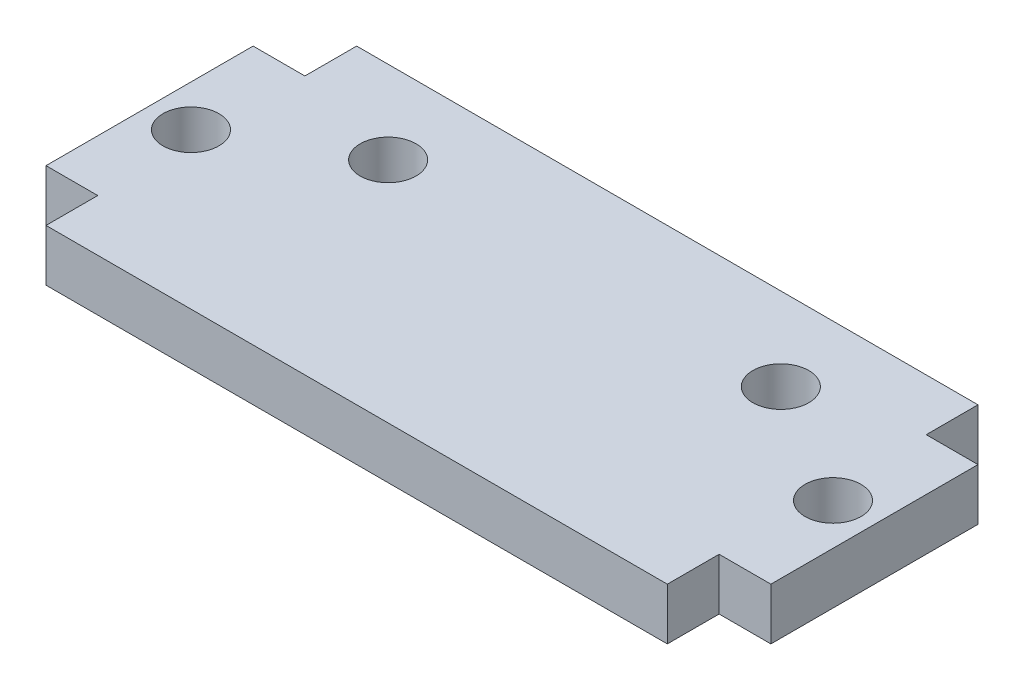
ISO-10303-21;
HEADER;
FILE_DESCRIPTION(('STEP AP214'),'2;1');
FILE_NAME('part.step','',(''),(''),'','','');
FILE_SCHEMA(('AUTOMOTIVE_DESIGN { 1 0 10303 214 1 1 1 1 }'));
ENDSEC;
DATA;
#1=APPLICATION_CONTEXT('core data for automotive mechanical design processes');
#2=APPLICATION_PROTOCOL_DEFINITION('international standard','automotive_design',2000,#1);
#3=PRODUCT_CONTEXT('',#1,'mechanical');
#4=PRODUCT('Part','Part','',(#3));
#5=PRODUCT_RELATED_PRODUCT_CATEGORY('part','',(#4));
#6=PRODUCT_DEFINITION_FORMATION('','',#4);
#7=PRODUCT_DEFINITION_CONTEXT('part definition',#1,'design');
#8=PRODUCT_DEFINITION('design','',#6,#7);
#9=PRODUCT_DEFINITION_SHAPE('','',#8);
#10=(LENGTH_UNIT() NAMED_UNIT(*) SI_UNIT(.MILLI.,.METRE.));
#11=(NAMED_UNIT(*) PLANE_ANGLE_UNIT() SI_UNIT($,.RADIAN.));
#12=(NAMED_UNIT(*) SI_UNIT($,.STERADIAN.) SOLID_ANGLE_UNIT());
#13=UNCERTAINTY_MEASURE_WITH_UNIT(LENGTH_MEASURE(1.E-05),#10,'distance_accuracy_value','');
#14=(GEOMETRIC_REPRESENTATION_CONTEXT(3) GLOBAL_UNCERTAINTY_ASSIGNED_CONTEXT((#13)) GLOBAL_UNIT_ASSIGNED_CONTEXT((#10,
#11,#12)) REPRESENTATION_CONTEXT('',''));
#15=CARTESIAN_POINT('',(0.,0.,0.));
#16=DIRECTION('',(0.,0.,1.));
#17=DIRECTION('',(1.,0.,0.));
#18=AXIS2_PLACEMENT_3D('',#15,#16,#17);
#19=CARTESIAN_POINT('',(0.,3.175,0.));
#20=DIRECTION('',(0.,1.,0.));
#21=DIRECTION('',(0.,0.,1.));
#22=AXIS2_PLACEMENT_3D('',#19,#20,#21);
#23=PLANE('',#22);
#24=CARTESIAN_POINT('',(-12.0396,3.175,-13.97));
#25=DIRECTION('',(0.,1.,0.));
#26=DIRECTION('',(0.,0.,1.));
#27=AXIS2_PLACEMENT_3D('',#24,#25,#26);
#28=CIRCLE('',#27,1.7145);
#29=CARTESIAN_POINT('',(-12.0396,3.175,-12.2555));
#30=VERTEX_POINT('',#29);
#31=EDGE_CURVE('E291',#30,#30,#28,.T.);
#32=ORIENTED_EDGE('',*,*,#31,.F.);
#33=EDGE_LOOP('',(#32));
#34=FACE_BOUND('',#33,.T.);
#35=CARTESIAN_POINT('',(-19.685,3.175,-9.52499999999999));
#36=DIRECTION('',(0.,1.,0.));
#37=DIRECTION('',(0.,0.,1.));
#38=AXIS2_PLACEMENT_3D('',#35,#36,#37);
#39=CIRCLE('',#38,1.7145);
#40=CARTESIAN_POINT('',(-19.685,3.175,-7.81049999999999));
#41=VERTEX_POINT('',#40);
#42=EDGE_CURVE('E158',#41,#41,#39,.T.);
#43=ORIENTED_EDGE('',*,*,#42,.F.);
#44=EDGE_LOOP('',(#43));
#45=FACE_BOUND('',#44,.T.);
#46=DIRECTION('',(0.,0.,1.));
#47=VECTOR('',#46,1.);
#48=CARTESIAN_POINT('',(-19.05,3.175,0.));
#49=LINE('',#48,#47);
#50=CARTESIAN_POINT('',(-19.05,3.175,-3.175));
#51=VERTEX_POINT('',#50);
#52=CARTESIAN_POINT('',(-19.05,3.175,0.));
#53=VERTEX_POINT('',#52);
#54=EDGE_CURVE('E177',#51,#53,#49,.T.);
#55=ORIENTED_EDGE('',*,*,#54,.T.);
#56=DIRECTION('',(1.,0.,0.));
#57=VECTOR('',#56,1.);
#58=CARTESIAN_POINT('',(19.05,3.175,0.));
#59=LINE('',#58,#57);
#60=CARTESIAN_POINT('',(19.05,3.175,0.));
#61=VERTEX_POINT('',#60);
#62=EDGE_CURVE('E105',#53,#61,#59,.T.);
#63=ORIENTED_EDGE('',*,*,#62,.T.);
#64=DIRECTION('',(0.,0.,-1.));
#65=VECTOR('',#64,1.);
#66=CARTESIAN_POINT('',(19.05,3.175,0.));
#67=LINE('',#66,#65);
#68=CARTESIAN_POINT('',(19.05,3.175,-3.175));
#69=VERTEX_POINT('',#68);
#70=EDGE_CURVE('E204',#61,#69,#67,.T.);
#71=ORIENTED_EDGE('',*,*,#70,.T.);
#72=DIRECTION('',(1.,0.,0.));
#73=VECTOR('',#72,1.);
#74=CARTESIAN_POINT('',(19.05,3.175,-3.175));
#75=LINE('',#74,#73);
#76=CARTESIAN_POINT('',(22.225,3.175,-3.175));
#77=VERTEX_POINT('',#76);
#78=EDGE_CURVE('E223',#69,#77,#75,.T.);
#79=ORIENTED_EDGE('',*,*,#78,.T.);
#80=DIRECTION('',(0.,0.,-1.));
#81=VECTOR('',#80,1.);
#82=CARTESIAN_POINT('',(22.225,3.175,-3.175));
#83=LINE('',#82,#81);
#84=CARTESIAN_POINT('',(22.225,3.175,-15.875));
#85=VERTEX_POINT('',#84);
#86=EDGE_CURVE('E220',#77,#85,#83,.T.);
#87=ORIENTED_EDGE('',*,*,#86,.T.);
#88=DIRECTION('',(-1.,0.,0.));
#89=VECTOR('',#88,1.);
#90=CARTESIAN_POINT('',(22.225,3.175,-15.875));
#91=LINE('',#90,#89);
#92=CARTESIAN_POINT('',(19.05,3.175,-15.875));
#93=VERTEX_POINT('',#92);
#94=EDGE_CURVE('E222',#85,#93,#91,.T.);
#95=ORIENTED_EDGE('',*,*,#94,.T.);
#96=DIRECTION('',(0.,0.,-1.));
#97=VECTOR('',#96,1.);
#98=CARTESIAN_POINT('',(19.05,3.175,-15.875));
#99=LINE('',#98,#97);
#100=CARTESIAN_POINT('',(19.05,3.175,-19.05));
#101=VERTEX_POINT('',#100);
#102=EDGE_CURVE('E225',#93,#101,#99,.T.);
#103=ORIENTED_EDGE('',*,*,#102,.T.);
#104=DIRECTION('',(-1.,0.,0.));
#105=VECTOR('',#104,1.);
#106=CARTESIAN_POINT('',(-19.05,3.175,-19.05));
#107=LINE('',#106,#105);
#108=CARTESIAN_POINT('',(-19.05,3.175,-19.05));
#109=VERTEX_POINT('',#108);
#110=EDGE_CURVE('E231',#101,#109,#107,.T.);
#111=ORIENTED_EDGE('',*,*,#110,.T.);
#112=DIRECTION('',(0.,0.,1.));
#113=VECTOR('',#112,1.);
#114=CARTESIAN_POINT('',(-19.05,3.175,-15.875));
#115=LINE('',#114,#113);
#116=CARTESIAN_POINT('',(-19.05,3.175,-15.875));
#117=VERTEX_POINT('',#116);
#118=EDGE_CURVE('E136',#109,#117,#115,.T.);
#119=ORIENTED_EDGE('',*,*,#118,.T.);
#120=DIRECTION('',(-1.,0.,0.));
#121=VECTOR('',#120,1.);
#122=CARTESIAN_POINT('',(-22.225,3.175,-15.875));
#123=LINE('',#122,#121);
#124=CARTESIAN_POINT('',(-22.225,3.175,-15.875));
#125=VERTEX_POINT('',#124);
#126=EDGE_CURVE('E130',#117,#125,#123,.T.);
#127=ORIENTED_EDGE('',*,*,#126,.T.);
#128=DIRECTION('',(0.,0.,1.));
#129=VECTOR('',#128,1.);
#130=CARTESIAN_POINT('',(-22.225,3.175,-3.175));
#131=LINE('',#130,#129);
#132=CARTESIAN_POINT('',(-22.225,3.175,-3.175));
#133=VERTEX_POINT('',#132);
#134=EDGE_CURVE('E134',#125,#133,#131,.T.);
#135=ORIENTED_EDGE('',*,*,#134,.T.);
#136=DIRECTION('',(1.,0.,0.));
#137=VECTOR('',#136,1.);
#138=CARTESIAN_POINT('',(-19.05,3.175,-3.175));
#139=LINE('',#138,#137);
#140=EDGE_CURVE('E50',#133,#51,#139,.T.);
#141=ORIENTED_EDGE('',*,*,#140,.T.);
#142=EDGE_LOOP('',(#55,#63,#71,#79,#87,#95,#103,#111,#119,#127,#135,#141));
#143=FACE_BOUND('',#142,.T.);
#144=CARTESIAN_POINT('',(19.685,3.175,-9.525));
#145=DIRECTION('',(0.,1.,0.));
#146=DIRECTION('',(0.,0.,-1.));
#147=AXIS2_PLACEMENT_3D('',#144,#145,#146);
#148=CIRCLE('',#147,1.7145);
#149=CARTESIAN_POINT('',(19.685,3.175,-11.2395));
#150=VERTEX_POINT('',#149);
#151=EDGE_CURVE('E297',#150,#150,#148,.T.);
#152=ORIENTED_EDGE('',*,*,#151,.F.);
#153=EDGE_LOOP('',(#152));
#154=FACE_BOUND('',#153,.T.);
#155=CARTESIAN_POINT('',(12.0396,3.175,-13.97));
#156=DIRECTION('',(0.,1.,0.));
#157=DIRECTION('',(0.,0.,-1.));
#158=AXIS2_PLACEMENT_3D('',#155,#156,#157);
#159=CIRCLE('',#158,1.7145);
#160=CARTESIAN_POINT('',(12.0396,3.175,-15.6845));
#161=VERTEX_POINT('',#160);
#162=EDGE_CURVE('E282',#161,#161,#159,.T.);
#163=ORIENTED_EDGE('',*,*,#162,.F.);
#164=EDGE_LOOP('',(#163));
#165=FACE_BOUND('',#164,.T.);
#166=ADVANCED_FACE('F33',(#34,#45,#143,#154,#165),#23,.T.);
#167=CARTESIAN_POINT('',(0.,0.,0.));
#168=DIRECTION('',(0.,1.,0.));
#169=DIRECTION('',(0.,0.,1.));
#170=AXIS2_PLACEMENT_3D('',#167,#168,#169);
#171=PLANE('',#170);
#172=DIRECTION('',(0.,0.,1.));
#173=VECTOR('',#172,1.);
#174=CARTESIAN_POINT('',(-19.05,0.,0.));
#175=LINE('',#174,#173);
#176=CARTESIAN_POINT('',(-19.05,0.,-3.175));
#177=VERTEX_POINT('',#176);
#178=CARTESIAN_POINT('',(-19.05,0.,0.));
#179=VERTEX_POINT('',#178);
#180=EDGE_CURVE('E154',#177,#179,#175,.T.);
#181=ORIENTED_EDGE('',*,*,#180,.F.);
#182=DIRECTION('',(1.,0.,0.));
#183=VECTOR('',#182,1.);
#184=CARTESIAN_POINT('',(-19.05,0.,-3.175));
#185=LINE('',#184,#183);
#186=CARTESIAN_POINT('',(-22.225,0.,-3.175));
#187=VERTEX_POINT('',#186);
#188=EDGE_CURVE('E97',#187,#177,#185,.T.);
#189=ORIENTED_EDGE('',*,*,#188,.F.);
#190=DIRECTION('',(0.,0.,1.));
#191=VECTOR('',#190,1.);
#192=CARTESIAN_POINT('',(-22.225,0.,-3.175));
#193=LINE('',#192,#191);
#194=CARTESIAN_POINT('',(-22.225,0.,-15.875));
#195=VERTEX_POINT('',#194);
#196=EDGE_CURVE('E91',#195,#187,#193,.T.);
#197=ORIENTED_EDGE('',*,*,#196,.F.);
#198=DIRECTION('',(-1.,0.,0.));
#199=VECTOR('',#198,1.);
#200=CARTESIAN_POINT('',(-22.225,0.,-15.875));
#201=LINE('',#200,#199);
#202=CARTESIAN_POINT('',(-19.05,0.,-15.875));
#203=VERTEX_POINT('',#202);
#204=EDGE_CURVE('E144',#203,#195,#201,.T.);
#205=ORIENTED_EDGE('',*,*,#204,.F.);
#206=DIRECTION('',(0.,0.,1.));
#207=VECTOR('',#206,1.);
#208=CARTESIAN_POINT('',(-19.05,0.,-15.875));
#209=LINE('',#208,#207);
#210=CARTESIAN_POINT('',(-19.05,0.,-19.05));
#211=VERTEX_POINT('',#210);
#212=EDGE_CURVE('E172',#211,#203,#209,.T.);
#213=ORIENTED_EDGE('',*,*,#212,.F.);
#214=DIRECTION('',(-1.,0.,0.));
#215=VECTOR('',#214,1.);
#216=CARTESIAN_POINT('',(-19.05,0.,-19.05));
#217=LINE('',#216,#215);
#218=CARTESIAN_POINT('',(19.05,0.,-19.05));
#219=VERTEX_POINT('',#218);
#220=EDGE_CURVE('E170',#219,#211,#217,.T.);
#221=ORIENTED_EDGE('',*,*,#220,.F.);
#222=DIRECTION('',(0.,0.,-1.));
#223=VECTOR('',#222,1.);
#224=CARTESIAN_POINT('',(19.05,0.,-15.875));
#225=LINE('',#224,#223);
#226=CARTESIAN_POINT('',(19.05,0.,-15.875));
#227=VERTEX_POINT('',#226);
#228=EDGE_CURVE('E168',#227,#219,#225,.T.);
#229=ORIENTED_EDGE('',*,*,#228,.F.);
#230=DIRECTION('',(-1.,0.,0.));
#231=VECTOR('',#230,1.);
#232=CARTESIAN_POINT('',(22.225,0.,-15.875));
#233=LINE('',#232,#231);
#234=CARTESIAN_POINT('',(22.225,0.,-15.875));
#235=VERTEX_POINT('',#234);
#236=EDGE_CURVE('E166',#235,#227,#233,.T.);
#237=ORIENTED_EDGE('',*,*,#236,.F.);
#238=DIRECTION('',(0.,0.,-1.));
#239=VECTOR('',#238,1.);
#240=CARTESIAN_POINT('',(22.225,0.,-3.175));
#241=LINE('',#240,#239);
#242=CARTESIAN_POINT('',(22.225,0.,-3.175));
#243=VERTEX_POINT('',#242);
#244=EDGE_CURVE('E164',#243,#235,#241,.T.);
#245=ORIENTED_EDGE('',*,*,#244,.F.);
#246=DIRECTION('',(1.,0.,0.));
#247=VECTOR('',#246,1.);
#248=CARTESIAN_POINT('',(19.05,0.,-3.175));
#249=LINE('',#248,#247);
#250=CARTESIAN_POINT('',(19.05,0.,-3.175));
#251=VERTEX_POINT('',#250);
#252=EDGE_CURVE('E162',#251,#243,#249,.T.);
#253=ORIENTED_EDGE('',*,*,#252,.F.);
#254=DIRECTION('',(0.,0.,-1.));
#255=VECTOR('',#254,1.);
#256=CARTESIAN_POINT('',(19.05,0.,0.));
#257=LINE('',#256,#255);
#258=CARTESIAN_POINT('',(19.05,0.,0.));
#259=VERTEX_POINT('',#258);
#260=EDGE_CURVE('E160',#259,#251,#257,.T.);
#261=ORIENTED_EDGE('',*,*,#260,.F.);
#262=DIRECTION('',(1.,0.,0.));
#263=VECTOR('',#262,1.);
#264=CARTESIAN_POINT('',(19.05,0.,0.));
#265=LINE('',#264,#263);
#266=EDGE_CURVE('E157',#179,#259,#265,.T.);
#267=ORIENTED_EDGE('',*,*,#266,.F.);
#268=EDGE_LOOP('',(#181,#189,#197,#205,#213,#221,#229,#237,#245,#253,#261,#267));
#269=FACE_BOUND('',#268,.T.);
#270=CARTESIAN_POINT('',(-19.685,0.,-9.52499999999999));
#271=DIRECTION('',(0.,1.,0.));
#272=DIRECTION('',(0.,0.,1.));
#273=AXIS2_PLACEMENT_3D('',#270,#271,#272);
#274=CIRCLE('',#273,1.7145);
#275=CARTESIAN_POINT('',(-19.685,0.,-7.81049999999999));
#276=VERTEX_POINT('',#275);
#277=EDGE_CURVE('E300',#276,#276,#274,.T.);
#278=ORIENTED_EDGE('',*,*,#277,.T.);
#279=EDGE_LOOP('',(#278));
#280=FACE_BOUND('',#279,.T.);
#281=CARTESIAN_POINT('',(19.685,0.,-9.525));
#282=DIRECTION('',(0.,1.,0.));
#283=DIRECTION('',(0.,0.,-1.));
#284=AXIS2_PLACEMENT_3D('',#281,#282,#283);
#285=CIRCLE('',#284,1.7145);
#286=CARTESIAN_POINT('',(19.685,0.,-11.2395));
#287=VERTEX_POINT('',#286);
#288=EDGE_CURVE('E294',#287,#287,#285,.T.);
#289=ORIENTED_EDGE('',*,*,#288,.T.);
#290=EDGE_LOOP('',(#289));
#291=FACE_BOUND('',#290,.T.);
#292=CARTESIAN_POINT('',(-12.0396,0.,-13.97));
#293=DIRECTION('',(0.,1.,0.));
#294=DIRECTION('',(0.,0.,1.));
#295=AXIS2_PLACEMENT_3D('',#292,#293,#294);
#296=CIRCLE('',#295,1.7145);
#297=CARTESIAN_POINT('',(-12.0396,0.,-12.2555));
#298=VERTEX_POINT('',#297);
#299=EDGE_CURVE('E288',#298,#298,#296,.T.);
#300=ORIENTED_EDGE('',*,*,#299,.T.);
#301=EDGE_LOOP('',(#300));
#302=FACE_BOUND('',#301,.T.);
#303=CARTESIAN_POINT('',(12.0396,0.,-13.97));
#304=DIRECTION('',(0.,1.,0.));
#305=DIRECTION('',(0.,0.,-1.));
#306=AXIS2_PLACEMENT_3D('',#303,#304,#305);
#307=CIRCLE('',#306,1.7145);
#308=CARTESIAN_POINT('',(12.0396,0.,-15.6845));
#309=VERTEX_POINT('',#308);
#310=EDGE_CURVE('E285',#309,#309,#307,.T.);
#311=ORIENTED_EDGE('',*,*,#310,.T.);
#312=EDGE_LOOP('',(#311));
#313=FACE_BOUND('',#312,.T.);
#314=ADVANCED_FACE('F208',(#269,#280,#291,#302,#313),#171,.F.);
#315=CARTESIAN_POINT('',(-19.05,3.175,0.));
#316=DIRECTION('',(1.,0.,0.));
#317=DIRECTION('',(0.,0.,-1.));
#318=AXIS2_PLACEMENT_3D('',#315,#316,#317);
#319=PLANE('',#318);
#320=ORIENTED_EDGE('',*,*,#180,.T.);
#321=DIRECTION('',(0.,-1.,0.));
#322=VECTOR('',#321,1.);
#323=CARTESIAN_POINT('',(-19.05,3.175,0.));
#324=LINE('',#323,#322);
#325=EDGE_CURVE('E11',#53,#179,#324,.T.);
#326=ORIENTED_EDGE('',*,*,#325,.F.);
#327=ORIENTED_EDGE('',*,*,#54,.F.);
#328=DIRECTION('',(0.,-1.,0.));
#329=VECTOR('',#328,1.);
#330=CARTESIAN_POINT('',(-19.05,3.175,-3.175));
#331=LINE('',#330,#329);
#332=EDGE_CURVE('E150',#51,#177,#331,.T.);
#333=ORIENTED_EDGE('',*,*,#332,.T.);
#334=EDGE_LOOP('',(#320,#326,#327,#333));
#335=FACE_BOUND('',#334,.T.);
#336=ADVANCED_FACE('F35',(#335),#319,.F.);
#337=CARTESIAN_POINT('',(19.05,3.175,0.));
#338=DIRECTION('',(0.,0.,-1.));
#339=DIRECTION('',(-1.,0.,0.));
#340=AXIS2_PLACEMENT_3D('',#337,#338,#339);
#341=PLANE('',#340);
#342=ORIENTED_EDGE('',*,*,#266,.T.);
#343=DIRECTION('',(0.,-1.,0.));
#344=VECTOR('',#343,1.);
#345=CARTESIAN_POINT('',(19.05,3.175,0.));
#346=LINE('',#345,#344);
#347=EDGE_CURVE('E42',#61,#259,#346,.T.);
#348=ORIENTED_EDGE('',*,*,#347,.F.);
#349=ORIENTED_EDGE('',*,*,#62,.F.);
#350=ORIENTED_EDGE('',*,*,#325,.T.);
#351=EDGE_LOOP('',(#342,#348,#349,#350));
#352=FACE_BOUND('',#351,.T.);
#353=ADVANCED_FACE('F410',(#352),#341,.F.);
#354=CARTESIAN_POINT('',(19.05,3.175,0.));
#355=DIRECTION('',(-1.,0.,0.));
#356=DIRECTION('',(0.,0.,1.));
#357=AXIS2_PLACEMENT_3D('',#354,#355,#356);
#358=PLANE('',#357);
#359=ORIENTED_EDGE('',*,*,#260,.T.);
#360=DIRECTION('',(0.,-1.,0.));
#361=VECTOR('',#360,1.);
#362=CARTESIAN_POINT('',(19.05,3.175,-3.175));
#363=LINE('',#362,#361);
#364=EDGE_CURVE('E196',#69,#251,#363,.T.);
#365=ORIENTED_EDGE('',*,*,#364,.F.);
#366=ORIENTED_EDGE('',*,*,#70,.F.);
#367=ORIENTED_EDGE('',*,*,#347,.T.);
#368=EDGE_LOOP('',(#359,#365,#366,#367));
#369=FACE_BOUND('',#368,.T.);
#370=ADVANCED_FACE('F202',(#369),#358,.F.);
#371=CARTESIAN_POINT('',(19.05,3.175,-3.175));
#372=DIRECTION('',(0.,0.,-1.));
#373=DIRECTION('',(-1.,0.,0.));
#374=AXIS2_PLACEMENT_3D('',#371,#372,#373);
#375=PLANE('',#374);
#376=ORIENTED_EDGE('',*,*,#252,.T.);
#377=DIRECTION('',(0.,-1.,0.));
#378=VECTOR('',#377,1.);
#379=CARTESIAN_POINT('',(22.225,3.175,-3.175));
#380=LINE('',#379,#378);
#381=EDGE_CURVE('E193',#77,#243,#380,.T.);
#382=ORIENTED_EDGE('',*,*,#381,.F.);
#383=ORIENTED_EDGE('',*,*,#78,.F.);
#384=ORIENTED_EDGE('',*,*,#364,.T.);
#385=EDGE_LOOP('',(#376,#382,#383,#384));
#386=FACE_BOUND('',#385,.T.);
#387=ADVANCED_FACE('F214',(#386),#375,.F.);
#388=CARTESIAN_POINT('',(22.225,3.175,-3.175));
#389=DIRECTION('',(-1.,0.,0.));
#390=DIRECTION('',(0.,0.,1.));
#391=AXIS2_PLACEMENT_3D('',#388,#389,#390);
#392=PLANE('',#391);
#393=ORIENTED_EDGE('',*,*,#244,.T.);
#394=DIRECTION('',(0.,-1.,0.));
#395=VECTOR('',#394,1.);
#396=CARTESIAN_POINT('',(22.225,3.175,-15.875));
#397=LINE('',#396,#395);
#398=EDGE_CURVE('E190',#85,#235,#397,.T.);
#399=ORIENTED_EDGE('',*,*,#398,.F.);
#400=ORIENTED_EDGE('',*,*,#86,.F.);
#401=ORIENTED_EDGE('',*,*,#381,.T.);
#402=EDGE_LOOP('',(#393,#399,#400,#401));
#403=FACE_BOUND('',#402,.T.);
#404=ADVANCED_FACE('F218',(#403),#392,.F.);
#405=CARTESIAN_POINT('',(22.225,3.175,-15.875));
#406=DIRECTION('',(0.,0.,1.));
#407=DIRECTION('',(1.,0.,0.));
#408=AXIS2_PLACEMENT_3D('',#405,#406,#407);
#409=PLANE('',#408);
#410=ORIENTED_EDGE('',*,*,#236,.T.);
#411=DIRECTION('',(0.,-1.,0.));
#412=VECTOR('',#411,1.);
#413=CARTESIAN_POINT('',(19.05,3.175,-15.875));
#414=LINE('',#413,#412);
#415=EDGE_CURVE('E187',#93,#227,#414,.T.);
#416=ORIENTED_EDGE('',*,*,#415,.F.);
#417=ORIENTED_EDGE('',*,*,#94,.F.);
#418=ORIENTED_EDGE('',*,*,#398,.T.);
#419=EDGE_LOOP('',(#410,#416,#417,#418));
#420=FACE_BOUND('',#419,.T.);
#421=ADVANCED_FACE('F375',(#420),#409,.F.);
#422=CARTESIAN_POINT('',(19.05,3.175,-15.875));
#423=DIRECTION('',(-1.,0.,0.));
#424=DIRECTION('',(0.,0.,1.));
#425=AXIS2_PLACEMENT_3D('',#422,#423,#424);
#426=PLANE('',#425);
#427=ORIENTED_EDGE('',*,*,#228,.T.);
#428=DIRECTION('',(0.,-1.,0.));
#429=VECTOR('',#428,1.);
#430=CARTESIAN_POINT('',(19.05,3.175,-19.05));
#431=LINE('',#430,#429);
#432=EDGE_CURVE('E184',#101,#219,#431,.T.);
#433=ORIENTED_EDGE('',*,*,#432,.F.);
#434=ORIENTED_EDGE('',*,*,#102,.F.);
#435=ORIENTED_EDGE('',*,*,#415,.T.);
#436=EDGE_LOOP('',(#427,#433,#434,#435));
#437=FACE_BOUND('',#436,.T.);
#438=ADVANCED_FACE('F366',(#437),#426,.F.);
#439=CARTESIAN_POINT('',(-19.05,3.175,-19.05));
#440=DIRECTION('',(0.,0.,1.));
#441=DIRECTION('',(1.,0.,0.));
#442=AXIS2_PLACEMENT_3D('',#439,#440,#441);
#443=PLANE('',#442);
#444=ORIENTED_EDGE('',*,*,#220,.T.);
#445=DIRECTION('',(0.,-1.,0.));
#446=VECTOR('',#445,1.);
#447=CARTESIAN_POINT('',(-19.05,3.175,-19.05));
#448=LINE('',#447,#446);
#449=EDGE_CURVE('E181',#109,#211,#448,.T.);
#450=ORIENTED_EDGE('',*,*,#449,.F.);
#451=ORIENTED_EDGE('',*,*,#110,.F.);
#452=ORIENTED_EDGE('',*,*,#432,.T.);
#453=EDGE_LOOP('',(#444,#450,#451,#452));
#454=FACE_BOUND('',#453,.T.);
#455=ADVANCED_FACE('F237',(#454),#443,.F.);
#456=CARTESIAN_POINT('',(-19.05,3.175,-15.875));
#457=DIRECTION('',(1.,0.,0.));
#458=DIRECTION('',(0.,0.,-1.));
#459=AXIS2_PLACEMENT_3D('',#456,#457,#458);
#460=PLANE('',#459);
#461=ORIENTED_EDGE('',*,*,#212,.T.);
#462=DIRECTION('',(0.,-1.,0.));
#463=VECTOR('',#462,1.);
#464=CARTESIAN_POINT('',(-19.05,3.175,-15.875));
#465=LINE('',#464,#463);
#466=EDGE_CURVE('E145',#117,#203,#465,.T.);
#467=ORIENTED_EDGE('',*,*,#466,.F.);
#468=ORIENTED_EDGE('',*,*,#118,.F.);
#469=ORIENTED_EDGE('',*,*,#449,.T.);
#470=EDGE_LOOP('',(#461,#467,#468,#469));
#471=FACE_BOUND('',#470,.T.);
#472=ADVANCED_FACE('F241',(#471),#460,.F.);
#473=CARTESIAN_POINT('',(-22.225,3.175,-15.875));
#474=DIRECTION('',(0.,0.,1.));
#475=DIRECTION('',(1.,0.,0.));
#476=AXIS2_PLACEMENT_3D('',#473,#474,#475);
#477=PLANE('',#476);
#478=ORIENTED_EDGE('',*,*,#204,.T.);
#479=DIRECTION('',(0.,-1.,0.));
#480=VECTOR('',#479,1.);
#481=CARTESIAN_POINT('',(-22.225,3.175,-15.875));
#482=LINE('',#481,#480);
#483=EDGE_CURVE('E141',#125,#195,#482,.T.);
#484=ORIENTED_EDGE('',*,*,#483,.F.);
#485=ORIENTED_EDGE('',*,*,#126,.F.);
#486=ORIENTED_EDGE('',*,*,#466,.T.);
#487=EDGE_LOOP('',(#478,#484,#485,#486));
#488=FACE_BOUND('',#487,.T.);
#489=ADVANCED_FACE('F142',(#488),#477,.F.);
#490=CARTESIAN_POINT('',(-22.225,3.175,-3.175));
#491=DIRECTION('',(1.,0.,0.));
#492=DIRECTION('',(0.,0.,-1.));
#493=AXIS2_PLACEMENT_3D('',#490,#491,#492);
#494=PLANE('',#493);
#495=ORIENTED_EDGE('',*,*,#196,.T.);
#496=DIRECTION('',(0.,-1.,0.));
#497=VECTOR('',#496,1.);
#498=CARTESIAN_POINT('',(-22.225,3.175,-3.175));
#499=LINE('',#498,#497);
#500=EDGE_CURVE('E146',#133,#187,#499,.T.);
#501=ORIENTED_EDGE('',*,*,#500,.F.);
#502=ORIENTED_EDGE('',*,*,#134,.F.);
#503=ORIENTED_EDGE('',*,*,#483,.T.);
#504=EDGE_LOOP('',(#495,#501,#502,#503));
#505=FACE_BOUND('',#504,.T.);
#506=ADVANCED_FACE('F148',(#505),#494,.F.);
#507=CARTESIAN_POINT('',(-19.05,3.175,-3.175));
#508=DIRECTION('',(0.,0.,-1.));
#509=DIRECTION('',(-1.,0.,0.));
#510=AXIS2_PLACEMENT_3D('',#507,#508,#509);
#511=PLANE('',#510);
#512=ORIENTED_EDGE('',*,*,#188,.T.);
#513=ORIENTED_EDGE('',*,*,#332,.F.);
#514=ORIENTED_EDGE('',*,*,#140,.F.);
#515=ORIENTED_EDGE('',*,*,#500,.T.);
#516=EDGE_LOOP('',(#512,#513,#514,#515));
#517=FACE_BOUND('',#516,.T.);
#518=ADVANCED_FACE('F245',(#517),#511,.F.);
#519=CARTESIAN_POINT('',(-19.685,3.175,-9.52499999999999));
#520=DIRECTION('',(0.,-1.,0.));
#521=DIRECTION('',(0.,0.,-1.));
#522=AXIS2_PLACEMENT_3D('',#519,#520,#521);
#523=CYLINDRICAL_SURFACE('',#522,1.7145);
#524=ORIENTED_EDGE('',*,*,#42,.T.);
#525=EDGE_LOOP('',(#524));
#526=FACE_BOUND('',#525,.T.);
#527=ORIENTED_EDGE('',*,*,#277,.F.);
#528=EDGE_LOOP('',(#527));
#529=FACE_BOUND('',#528,.T.);
#530=ADVANCED_FACE('F247',(#526,#529),#523,.F.);
#531=CARTESIAN_POINT('',(19.685,3.175,-9.525));
#532=DIRECTION('',(0.,-1.,0.));
#533=DIRECTION('',(0.,0.,-1.));
#534=AXIS2_PLACEMENT_3D('',#531,#532,#533);
#535=CYLINDRICAL_SURFACE('',#534,1.7145);
#536=ORIENTED_EDGE('',*,*,#151,.T.);
#537=EDGE_LOOP('',(#536));
#538=FACE_BOUND('',#537,.T.);
#539=ORIENTED_EDGE('',*,*,#288,.F.);
#540=EDGE_LOOP('',(#539));
#541=FACE_BOUND('',#540,.T.);
#542=ADVANCED_FACE('F253',(#538,#541),#535,.F.);
#543=CARTESIAN_POINT('',(-12.0396,3.175,-13.97));
#544=DIRECTION('',(0.,-1.,0.));
#545=DIRECTION('',(0.,0.,-1.));
#546=AXIS2_PLACEMENT_3D('',#543,#544,#545);
#547=CYLINDRICAL_SURFACE('',#546,1.7145);
#548=ORIENTED_EDGE('',*,*,#31,.T.);
#549=EDGE_LOOP('',(#548));
#550=FACE_BOUND('',#549,.T.);
#551=ORIENTED_EDGE('',*,*,#299,.F.);
#552=EDGE_LOOP('',(#551));
#553=FACE_BOUND('',#552,.T.);
#554=ADVANCED_FACE('F269',(#550,#553),#547,.F.);
#555=CARTESIAN_POINT('',(12.0396,3.175,-13.97));
#556=DIRECTION('',(0.,-1.,0.));
#557=DIRECTION('',(0.,0.,-1.));
#558=AXIS2_PLACEMENT_3D('',#555,#556,#557);
#559=CYLINDRICAL_SURFACE('',#558,1.7145);
#560=ORIENTED_EDGE('',*,*,#162,.T.);
#561=EDGE_LOOP('',(#560));
#562=FACE_BOUND('',#561,.T.);
#563=ORIENTED_EDGE('',*,*,#310,.F.);
#564=EDGE_LOOP('',(#563));
#565=FACE_BOUND('',#564,.T.);
#566=ADVANCED_FACE('F273',(#562,#565),#559,.F.);
#567=CLOSED_SHELL('',(#166,#314,#336,#353,#370,#387,#404,#421,#438,#455,#472,#489,#506,#518,
#530,#542,#554,#566));
#568=MANIFOLD_SOLID_BREP('B2',#567);
#569=ADVANCED_BREP_SHAPE_REPRESENTATION('',(#18,#568),#14);
#570=SHAPE_DEFINITION_REPRESENTATION(#9,#569);
ENDSEC;
END-ISO-10303-21;
